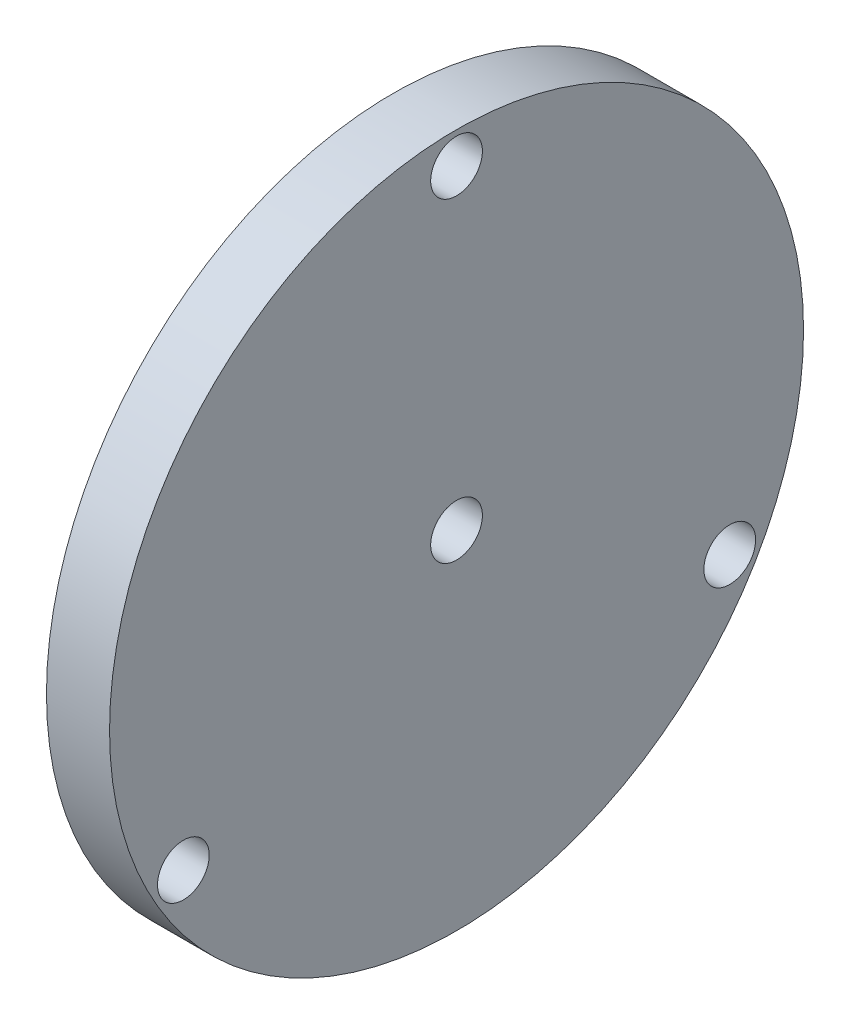
ISO-10303-21;
HEADER;
FILE_DESCRIPTION(('STEP AP214'),'2;1');
FILE_NAME('part.step','',(''),(''),'','','');
FILE_SCHEMA(('AUTOMOTIVE_DESIGN { 1 0 10303 214 1 1 1 1 }'));
ENDSEC;
DATA;
#1=APPLICATION_CONTEXT('core data for automotive mechanical design processes');
#2=APPLICATION_PROTOCOL_DEFINITION('international standard','automotive_design',2000,#1);
#3=PRODUCT_CONTEXT('',#1,'mechanical');
#4=PRODUCT('Part','Part','',(#3));
#5=PRODUCT_RELATED_PRODUCT_CATEGORY('part','',(#4));
#6=PRODUCT_DEFINITION_FORMATION('','',#4);
#7=PRODUCT_DEFINITION_CONTEXT('part definition',#1,'design');
#8=PRODUCT_DEFINITION('design','',#6,#7);
#9=PRODUCT_DEFINITION_SHAPE('','',#8);
#10=(LENGTH_UNIT() NAMED_UNIT(*) SI_UNIT(.MILLI.,.METRE.));
#11=(NAMED_UNIT(*) PLANE_ANGLE_UNIT() SI_UNIT($,.RADIAN.));
#12=(NAMED_UNIT(*) SI_UNIT($,.STERADIAN.) SOLID_ANGLE_UNIT());
#13=UNCERTAINTY_MEASURE_WITH_UNIT(LENGTH_MEASURE(1.E-05),#10,'distance_accuracy_value','');
#14=(GEOMETRIC_REPRESENTATION_CONTEXT(3) GLOBAL_UNCERTAINTY_ASSIGNED_CONTEXT((#13)) GLOBAL_UNIT_ASSIGNED_CONTEXT((#10,
#11,#12)) REPRESENTATION_CONTEXT('',''));
#15=CARTESIAN_POINT('',(0.,0.,0.));
#16=DIRECTION('',(0.,0.,1.));
#17=DIRECTION('',(1.,0.,0.));
#18=AXIS2_PLACEMENT_3D('',#15,#16,#17);
#19=CARTESIAN_POINT('',(10.,0.,0.));
#20=DIRECTION('',(-1.,0.,0.));
#21=DIRECTION('',(0.,0.,1.));
#22=AXIS2_PLACEMENT_3D('',#19,#20,#21);
#23=CYLINDRICAL_SURFACE('',#22,55.);
#24=CARTESIAN_POINT('',(10.,0.,0.));
#25=DIRECTION('',(1.,0.,0.));
#26=DIRECTION('',(0.,0.,-1.));
#27=AXIS2_PLACEMENT_3D('',#24,#25,#26);
#28=CIRCLE('',#27,55.);
#29=CARTESIAN_POINT('',(10.,0.,-55.));
#30=VERTEX_POINT('',#29);
#31=EDGE_CURVE('E10',#30,#30,#28,.T.);
#32=ORIENTED_EDGE('',*,*,#31,.F.);
#33=EDGE_LOOP('',(#32));
#34=FACE_BOUND('',#33,.T.);
#35=CARTESIAN_POINT('',(0.,0.,0.));
#36=DIRECTION('',(1.,0.,0.));
#37=DIRECTION('',(0.,0.,-1.));
#38=AXIS2_PLACEMENT_3D('',#35,#36,#37);
#39=CIRCLE('',#38,55.);
#40=CARTESIAN_POINT('',(0.,0.,-55.));
#41=VERTEX_POINT('',#40);
#42=EDGE_CURVE('E36',#41,#41,#39,.T.);
#43=ORIENTED_EDGE('',*,*,#42,.T.);
#44=EDGE_LOOP('',(#43));
#45=FACE_BOUND('',#44,.T.);
#46=ADVANCED_FACE('F33',(#34,#45),#23,.T.);
#47=CARTESIAN_POINT('',(10.,0.,0.));
#48=DIRECTION('',(1.,0.,0.));
#49=DIRECTION('',(0.,0.,-1.));
#50=AXIS2_PLACEMENT_3D('',#47,#48,#49);
#51=PLANE('',#50);
#52=CARTESIAN_POINT('',(10.,50.,-3.67348049511641E-12));
#53=DIRECTION('',(1.,0.,0.));
#54=DIRECTION('',(0.,0.,-1.));
#55=AXIS2_PLACEMENT_3D('',#52,#53,#54);
#56=CIRCLE('',#55,4.1);
#57=CARTESIAN_POINT('',(10.,50.,-4.10000000000367));
#58=VERTEX_POINT('',#57);
#59=EDGE_CURVE('E48',#58,#58,#56,.T.);
#60=ORIENTED_EDGE('',*,*,#59,.F.);
#61=EDGE_LOOP('',(#60));
#62=FACE_BOUND('',#61,.T.);
#63=CARTESIAN_POINT('',(10.,-25.0000000000015,-43.3012701892229));
#64=DIRECTION('',(1.,0.,0.));
#65=DIRECTION('',(0.,0.,-1.));
#66=AXIS2_PLACEMENT_3D('',#63,#64,#65);
#67=CIRCLE('',#66,4.1);
#68=CARTESIAN_POINT('',(10.,-25.0000000000015,-47.4012701892229));
#69=VERTEX_POINT('',#68);
#70=EDGE_CURVE('E60',#69,#69,#67,.T.);
#71=ORIENTED_EDGE('',*,*,#70,.F.);
#72=EDGE_LOOP('',(#71));
#73=FACE_BOUND('',#72,.T.);
#74=CARTESIAN_POINT('',(10.,-24.9999999999985,43.3012701892209));
#75=DIRECTION('',(1.,0.,0.));
#76=DIRECTION('',(0.,0.,-1.));
#77=AXIS2_PLACEMENT_3D('',#74,#75,#76);
#78=CIRCLE('',#77,4.1);
#79=CARTESIAN_POINT('',(10.,-24.9999999999985,39.2012701892209));
#80=VERTEX_POINT('',#79);
#81=EDGE_CURVE('E54',#80,#80,#78,.T.);
#82=ORIENTED_EDGE('',*,*,#81,.F.);
#83=EDGE_LOOP('',(#82));
#84=FACE_BOUND('',#83,.T.);
#85=CARTESIAN_POINT('',(10.,0.,0.));
#86=DIRECTION('',(1.,0.,0.));
#87=DIRECTION('',(0.,0.,-1.));
#88=AXIS2_PLACEMENT_3D('',#85,#86,#87);
#89=CIRCLE('',#88,4.1);
#90=CARTESIAN_POINT('',(10.,0.,-4.1));
#91=VERTEX_POINT('',#90);
#92=EDGE_CURVE('E43',#91,#91,#89,.T.);
#93=ORIENTED_EDGE('',*,*,#92,.F.);
#94=EDGE_LOOP('',(#93));
#95=FACE_BOUND('',#94,.T.);
#96=ORIENTED_EDGE('',*,*,#31,.T.);
#97=EDGE_LOOP('',(#96));
#98=FACE_BOUND('',#97,.T.);
#99=ADVANCED_FACE('F72',(#62,#73,#84,#95,#98),#51,.T.);
#100=CARTESIAN_POINT('',(0.,0.,0.));
#101=DIRECTION('',(1.,0.,0.));
#102=DIRECTION('',(0.,0.,-1.));
#103=AXIS2_PLACEMENT_3D('',#100,#101,#102);
#104=PLANE('',#103);
#105=CARTESIAN_POINT('',(0.,50.,-3.67348049511641E-12));
#106=DIRECTION('',(1.,0.,0.));
#107=DIRECTION('',(0.,0.,-1.));
#108=AXIS2_PLACEMENT_3D('',#105,#106,#107);
#109=CIRCLE('',#108,4.1);
#110=CARTESIAN_POINT('',(0.,50.,-4.10000000000367));
#111=VERTEX_POINT('',#110);
#112=EDGE_CURVE('E63',#111,#111,#109,.T.);
#113=ORIENTED_EDGE('',*,*,#112,.T.);
#114=EDGE_LOOP('',(#113));
#115=FACE_BOUND('',#114,.T.);
#116=CARTESIAN_POINT('',(0.,-25.0000000000015,-43.3012701892229));
#117=DIRECTION('',(1.,0.,0.));
#118=DIRECTION('',(0.,0.,-1.));
#119=AXIS2_PLACEMENT_3D('',#116,#117,#118);
#120=CIRCLE('',#119,4.1);
#121=CARTESIAN_POINT('',(0.,-25.0000000000015,-47.4012701892229));
#122=VERTEX_POINT('',#121);
#123=EDGE_CURVE('E57',#122,#122,#120,.T.);
#124=ORIENTED_EDGE('',*,*,#123,.T.);
#125=EDGE_LOOP('',(#124));
#126=FACE_BOUND('',#125,.T.);
#127=CARTESIAN_POINT('',(0.,-24.9999999999985,43.3012701892209));
#128=DIRECTION('',(1.,0.,0.));
#129=DIRECTION('',(0.,0.,-1.));
#130=AXIS2_PLACEMENT_3D('',#127,#128,#129);
#131=CIRCLE('',#130,4.1);
#132=CARTESIAN_POINT('',(0.,-24.9999999999985,39.2012701892209));
#133=VERTEX_POINT('',#132);
#134=EDGE_CURVE('E51',#133,#133,#131,.T.);
#135=ORIENTED_EDGE('',*,*,#134,.T.);
#136=EDGE_LOOP('',(#135));
#137=FACE_BOUND('',#136,.T.);
#138=CARTESIAN_POINT('',(0.,0.,0.));
#139=DIRECTION('',(1.,0.,0.));
#140=DIRECTION('',(0.,0.,-1.));
#141=AXIS2_PLACEMENT_3D('',#138,#139,#140);
#142=CIRCLE('',#141,4.1);
#143=CARTESIAN_POINT('',(0.,0.,-4.1));
#144=VERTEX_POINT('',#143);
#145=EDGE_CURVE('E45',#144,#144,#142,.T.);
#146=ORIENTED_EDGE('',*,*,#145,.T.);
#147=EDGE_LOOP('',(#146));
#148=FACE_BOUND('',#147,.T.);
#149=ORIENTED_EDGE('',*,*,#42,.F.);
#150=EDGE_LOOP('',(#149));
#151=FACE_BOUND('',#150,.T.);
#152=ADVANCED_FACE('F75',(#115,#126,#137,#148,#151),#104,.F.);
#153=CARTESIAN_POINT('',(10.,0.,0.));
#154=DIRECTION('',(-1.,0.,0.));
#155=DIRECTION('',(0.,0.,1.));
#156=AXIS2_PLACEMENT_3D('',#153,#154,#155);
#157=CYLINDRICAL_SURFACE('',#156,4.1);
#158=ORIENTED_EDGE('',*,*,#92,.T.);
#159=EDGE_LOOP('',(#158));
#160=FACE_BOUND('',#159,.T.);
#161=ORIENTED_EDGE('',*,*,#145,.F.);
#162=EDGE_LOOP('',(#161));
#163=FACE_BOUND('',#162,.T.);
#164=ADVANCED_FACE('F83',(#160,#163),#157,.F.);
#165=CARTESIAN_POINT('',(10.,-24.9999999999985,43.3012701892209));
#166=DIRECTION('',(-1.,0.,0.));
#167=DIRECTION('',(0.,0.,1.));
#168=AXIS2_PLACEMENT_3D('',#165,#166,#167);
#169=CYLINDRICAL_SURFACE('',#168,4.1);
#170=ORIENTED_EDGE('',*,*,#81,.T.);
#171=EDGE_LOOP('',(#170));
#172=FACE_BOUND('',#171,.T.);
#173=ORIENTED_EDGE('',*,*,#134,.F.);
#174=EDGE_LOOP('',(#173));
#175=FACE_BOUND('',#174,.T.);
#176=ADVANCED_FACE('F86',(#172,#175),#169,.F.);
#177=CARTESIAN_POINT('',(10.,-25.0000000000015,-43.3012701892229));
#178=DIRECTION('',(-1.,0.,0.));
#179=DIRECTION('',(0.,0.,1.));
#180=AXIS2_PLACEMENT_3D('',#177,#178,#179);
#181=CYLINDRICAL_SURFACE('',#180,4.1);
#182=ORIENTED_EDGE('',*,*,#70,.T.);
#183=EDGE_LOOP('',(#182));
#184=FACE_BOUND('',#183,.T.);
#185=ORIENTED_EDGE('',*,*,#123,.F.);
#186=EDGE_LOOP('',(#185));
#187=FACE_BOUND('',#186,.T.);
#188=ADVANCED_FACE('F117',(#184,#187),#181,.F.);
#189=CARTESIAN_POINT('',(10.,50.,-3.67348049511641E-12));
#190=DIRECTION('',(-1.,0.,0.));
#191=DIRECTION('',(0.,0.,1.));
#192=AXIS2_PLACEMENT_3D('',#189,#190,#191);
#193=CYLINDRICAL_SURFACE('',#192,4.1);
#194=ORIENTED_EDGE('',*,*,#59,.T.);
#195=EDGE_LOOP('',(#194));
#196=FACE_BOUND('',#195,.T.);
#197=ORIENTED_EDGE('',*,*,#112,.F.);
#198=EDGE_LOOP('',(#197));
#199=FACE_BOUND('',#198,.T.);
#200=ADVANCED_FACE('F69',(#196,#199),#193,.F.);
#201=CLOSED_SHELL('',(#46,#99,#152,#164,#176,#188,#200));
#202=MANIFOLD_SOLID_BREP('B2',#201);
#203=ADVANCED_BREP_SHAPE_REPRESENTATION('',(#18,#202),#14);
#204=SHAPE_DEFINITION_REPRESENTATION(#9,#203);
ENDSEC;
END-ISO-10303-21;
